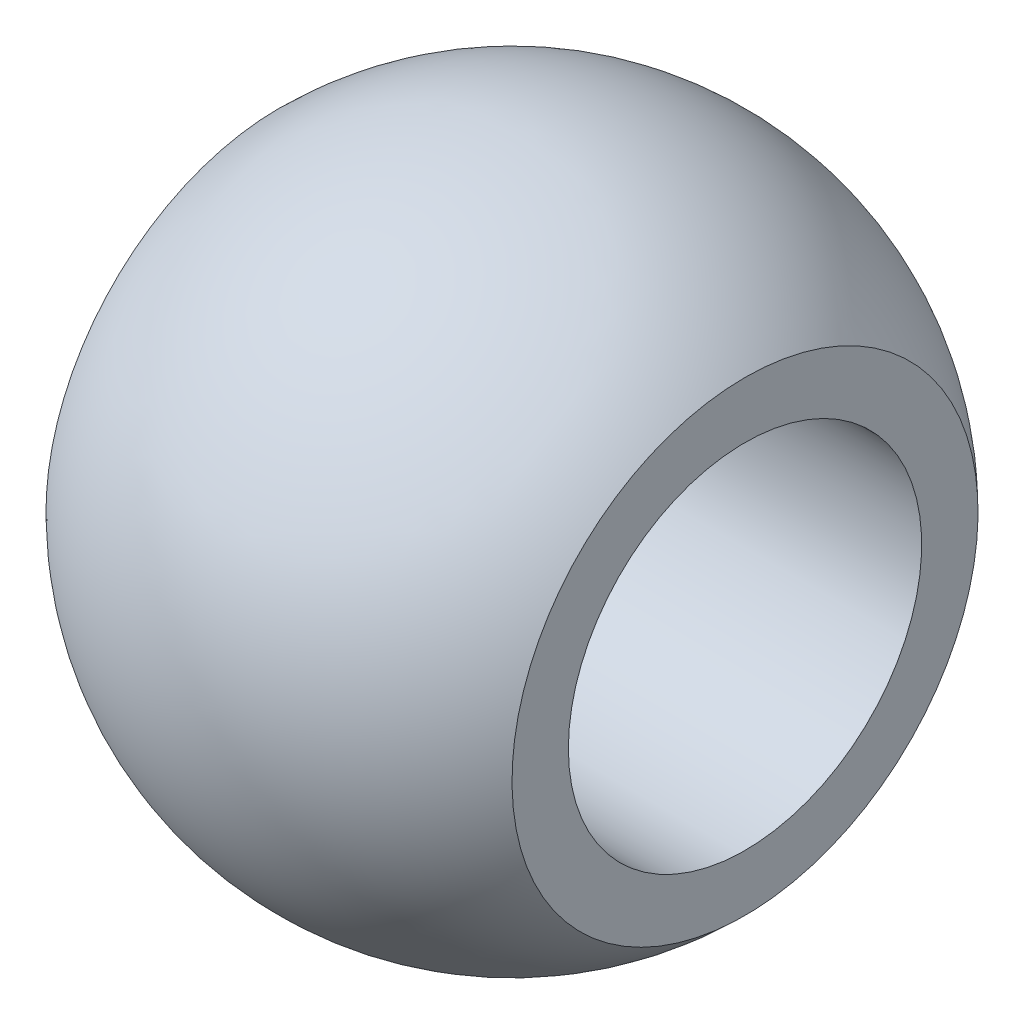
ISO-10303-21;
HEADER;
FILE_DESCRIPTION(('STEP AP214'),'2;1');
FILE_NAME('part.step','',(''),(''),'','','');
FILE_SCHEMA(('AUTOMOTIVE_DESIGN { 1 0 10303 214 1 1 1 1 }'));
ENDSEC;
DATA;
#1=APPLICATION_CONTEXT('core data for automotive mechanical design processes');
#2=APPLICATION_PROTOCOL_DEFINITION('international standard','automotive_design',2000,#1);
#3=PRODUCT_CONTEXT('',#1,'mechanical');
#4=PRODUCT('Part','Part','',(#3));
#5=PRODUCT_RELATED_PRODUCT_CATEGORY('part','',(#4));
#6=PRODUCT_DEFINITION_FORMATION('','',#4);
#7=PRODUCT_DEFINITION_CONTEXT('part definition',#1,'design');
#8=PRODUCT_DEFINITION('design','',#6,#7);
#9=PRODUCT_DEFINITION_SHAPE('','',#8);
#10=(LENGTH_UNIT() NAMED_UNIT(*) SI_UNIT(.MILLI.,.METRE.));
#11=(NAMED_UNIT(*) PLANE_ANGLE_UNIT() SI_UNIT($,.RADIAN.));
#12=(NAMED_UNIT(*) SI_UNIT($,.STERADIAN.) SOLID_ANGLE_UNIT());
#13=UNCERTAINTY_MEASURE_WITH_UNIT(LENGTH_MEASURE(1.E-05),#10,'distance_accuracy_value','');
#14=(GEOMETRIC_REPRESENTATION_CONTEXT(3) GLOBAL_UNCERTAINTY_ASSIGNED_CONTEXT((#13)) GLOBAL_UNIT_ASSIGNED_CONTEXT((#10,
#11,#12)) REPRESENTATION_CONTEXT('',''));
#15=CARTESIAN_POINT('',(0.,0.,0.));
#16=DIRECTION('',(0.,0.,1.));
#17=DIRECTION('',(1.,0.,0.));
#18=AXIS2_PLACEMENT_3D('',#15,#16,#17);
#19=CARTESIAN_POINT('',(-4.5,0.,0.));
#20=DIRECTION('',(-1.,0.,0.));
#21=DIRECTION('',(0.,0.,1.));
#22=AXIS2_PLACEMENT_3D('',#19,#20,#21);
#23=PLANE('',#22);
#24=CARTESIAN_POINT('',(-4.5,0.,0.));
#25=DIRECTION('',(-1.,0.,0.));
#26=DIRECTION('',(0.,0.,1.));
#27=AXIS2_PLACEMENT_3D('',#24,#25,#26);
#28=CIRCLE('',#27,4.5);
#29=CARTESIAN_POINT('',(-4.5,4.5,0.));
#30=VERTEX_POINT('',#29);
#31=EDGE_CURVE('E49',#30,#30,#28,.T.);
#32=ORIENTED_EDGE('',*,*,#31,.T.);
#33=EDGE_LOOP('',(#32));
#34=FACE_BOUND('',#33,.T.);
#35=CARTESIAN_POINT('',(-4.5,0.,0.));
#36=DIRECTION('',(-1.,0.,0.));
#37=DIRECTION('',(0.,0.,1.));
#38=AXIS2_PLACEMENT_3D('',#35,#36,#37);
#39=CIRCLE('',#38,3.41151905068336);
#40=CARTESIAN_POINT('',(-4.5,0.,3.41151905068336));
#41=VERTEX_POINT('',#40);
#42=EDGE_CURVE('E10',#41,#41,#39,.T.);
#43=ORIENTED_EDGE('',*,*,#42,.F.);
#44=EDGE_LOOP('',(#43));
#45=FACE_BOUND('',#44,.T.);
#46=ADVANCED_FACE('F35',(#34,#45),#23,.T.);
#47=CARTESIAN_POINT('',(-15.2152784756621,0.,0.));
#48=DIRECTION('',(-1.,0.,0.));
#49=DIRECTION('',(0.,0.,1.));
#50=AXIS2_PLACEMENT_3D('',#47,#48,#49);
#51=CYLINDRICAL_SURFACE('',#50,3.41151905068336);
#52=CARTESIAN_POINT('',(4.5,0.,0.));
#53=DIRECTION('',(-1.,0.,0.));
#54=DIRECTION('',(0.,0.,1.));
#55=AXIS2_PLACEMENT_3D('',#52,#53,#54);
#56=CIRCLE('',#55,3.41151905068336);
#57=CARTESIAN_POINT('',(4.5,0.,3.41151905068336));
#58=VERTEX_POINT('',#57);
#59=EDGE_CURVE('E41',#58,#58,#56,.T.);
#60=ORIENTED_EDGE('',*,*,#59,.F.);
#61=EDGE_LOOP('',(#60));
#62=FACE_BOUND('',#61,.T.);
#63=ORIENTED_EDGE('',*,*,#42,.T.);
#64=EDGE_LOOP('',(#63));
#65=FACE_BOUND('',#64,.T.);
#66=ADVANCED_FACE('F65',(#62,#65),#51,.F.);
#67=CARTESIAN_POINT('',(4.5,0.,0.));
#68=DIRECTION('',(-1.,0.,0.));
#69=DIRECTION('',(0.,0.,1.));
#70=AXIS2_PLACEMENT_3D('',#67,#68,#69);
#71=PLANE('',#70);
#72=CARTESIAN_POINT('',(4.5,0.,0.));
#73=DIRECTION('',(-1.,0.,0.));
#74=DIRECTION('',(0.,0.,1.));
#75=AXIS2_PLACEMENT_3D('',#72,#73,#74);
#76=CIRCLE('',#75,4.5);
#77=CARTESIAN_POINT('',(4.5,4.5,0.));
#78=VERTEX_POINT('',#77);
#79=EDGE_CURVE('E45',#78,#78,#76,.T.);
#80=ORIENTED_EDGE('',*,*,#79,.F.);
#81=EDGE_LOOP('',(#80));
#82=FACE_BOUND('',#81,.T.);
#83=ORIENTED_EDGE('',*,*,#59,.T.);
#84=EDGE_LOOP('',(#83));
#85=FACE_BOUND('',#84,.T.);
#86=ADVANCED_FACE('F60',(#82,#85),#71,.F.);
#87=CARTESIAN_POINT('',(0.,0.,0.));
#88=DIRECTION('',(-1.,0.,0.));
#89=DIRECTION('',(0.,1.,0.));
#90=AXIS2_PLACEMENT_3D('',#87,#88,#89);
#91=SPHERICAL_SURFACE('',#90,6.36396103067893);
#92=CARTESIAN_POINT('',(-4.5,4.5,0.));
#93=CARTESIAN_POINT('',(-4.42637040972548,4.57363271407349,0.));
#94=CARTESIAN_POINT('',(-4.35093070561752,4.64545504850886,0.));
#95=CARTESIAN_POINT('',(-4.19661933128227,4.78531312628446,0.));
#96=CARTESIAN_POINT('',(-4.117747661055,4.85334886962469,0.));
#97=CARTESIAN_POINT('',(-3.95676061602873,4.98546793339113,0.));
#98=CARTESIAN_POINT('',(-3.87464524122973,5.04955125381735,0.));
#99=CARTESIAN_POINT('',(-3.70736907835504,5.17361160596394,0.));
#100=CARTESIAN_POINT('',(-3.62220829027934,5.23358863768431,0.));
#101=CARTESIAN_POINT('',(-3.44904633520458,5.34929178408992,0.));
#102=CARTESIAN_POINT('',(-3.36104516820551,5.40501789877516,0.));
#103=CARTESIAN_POINT('',(-3.18241449141601,5.51208499910511,0.));
#104=CARTESIAN_POINT('',(-3.09178498162558,5.56342598474982,0.));
#105=CARTESIAN_POINT('',(-2.90811594467414,5.66159913213022,0.));
#106=CARTESIAN_POINT('',(-2.81507641751314,5.7084312938659,0.));
#107=CARTESIAN_POINT('',(-2.62681148860407,5.79747397331126,0.));
#108=CARTESIAN_POINT('',(-2.53158608685601,5.83968449102094,0.));
#109=CARTESIAN_POINT('',(-2.33917881445976,5.91938219286645,0.));
#110=CARTESIAN_POINT('',(-2.24199694381158,5.95686937700229,0.));
#111=CARTESIAN_POINT('',(-2.04591085342687,6.02703010198124,0.));
#112=CARTESIAN_POINT('',(-1.94700663369035,6.05970364282434,0.));
#113=CARTESIAN_POINT('',(-1.74771411401087,6.12015836774483,0.));
#114=CARTESIAN_POINT('',(-1.64732581406791,6.14793955182222,0.));
#115=CARTESIAN_POINT('',(-1.44530697819554,6.19854263591922,0.));
#116=CARTESIAN_POINT('',(-1.34367644226613,6.22136453593883,0.));
#117=CARTESIAN_POINT('',(-1.13941797128036,6.26199407196049,0.));
#118=CARTESIAN_POINT('',(-1.03679003622399,6.27980170796254,0.));
#119=CARTESIAN_POINT('',(-0.830784006669909,6.31035981579516,0.));
#120=CARTESIAN_POINT('',(-0.727405912172186,6.32311028762574,0.));
#121=CARTESIAN_POINT('',(-0.520148610619636,6.3435233501117,0.));
#122=CARTESIAN_POINT('',(-0.41626940356481,6.35118594076709,0.));
#123=CARTESIAN_POINT('',(-0.208260131006655,6.36140478105071,0.));
#124=CARTESIAN_POINT('',(-0.104130065503327,6.36396103067893,0.));
#125=CARTESIAN_POINT('',(0.104130065503329,6.36396103067893,0.));
#126=CARTESIAN_POINT('',(0.208260131006657,6.3614047810507,0.));
#127=CARTESIAN_POINT('',(0.416269403564811,6.35118594076709,0.));
#128=CARTESIAN_POINT('',(0.520148610619638,6.3435233501117,0.));
#129=CARTESIAN_POINT('',(0.727405912172187,6.32311028762574,0.));
#130=CARTESIAN_POINT('',(0.83078400666991,6.31035981579516,0.));
#131=CARTESIAN_POINT('',(1.036790036224,6.27980170796254,0.));
#132=CARTESIAN_POINT('',(1.13941797128036,6.26199407196049,0.));
#133=CARTESIAN_POINT('',(1.34367644226613,6.22136453593883,0.));
#134=CARTESIAN_POINT('',(1.44530697819554,6.19854263591922,0.));
#135=CARTESIAN_POINT('',(1.64732581406791,6.14793955182222,0.));
#136=CARTESIAN_POINT('',(1.74771411401087,6.12015836774483,0.));
#137=CARTESIAN_POINT('',(1.94700663369035,6.05970364282434,0.));
#138=CARTESIAN_POINT('',(2.04591085342687,6.02703010198124,0.));
#139=CARTESIAN_POINT('',(2.24199694381158,5.95686937700229,0.));
#140=CARTESIAN_POINT('',(2.33917881445976,5.91938219286645,0.));
#141=CARTESIAN_POINT('',(2.53158608685601,5.83968449102094,0.));
#142=CARTESIAN_POINT('',(2.62681148860407,5.79747397331126,0.));
#143=CARTESIAN_POINT('',(2.81507641751314,5.7084312938659,0.));
#144=CARTESIAN_POINT('',(2.90811594467414,5.66159913213022,0.));
#145=CARTESIAN_POINT('',(3.09178498162558,5.56342598474982,0.));
#146=CARTESIAN_POINT('',(3.18241449141601,5.51208499910511,0.));
#147=CARTESIAN_POINT('',(3.36104516820551,5.40501789877516,0.));
#148=CARTESIAN_POINT('',(3.44904633520458,5.34929178408992,0.));
#149=CARTESIAN_POINT('',(3.62220829027934,5.23358863768431,0.));
#150=CARTESIAN_POINT('',(3.70736907835504,5.17361160596394,0.));
#151=CARTESIAN_POINT('',(3.87464524122973,5.04955125381735,0.));
#152=CARTESIAN_POINT('',(3.95676061602873,4.98546793339113,0.));
#153=CARTESIAN_POINT('',(4.117747661055,4.85334886962469,0.));
#154=CARTESIAN_POINT('',(4.19661933128227,4.78531312628445,0.));
#155=CARTESIAN_POINT('',(4.35093070561752,4.64545504850886,0.));
#156=CARTESIAN_POINT('',(4.42637040972548,4.57363271407349,0.));
#157=CARTESIAN_POINT('',(4.5,4.5,0.));
#158=B_SPLINE_CURVE_WITH_KNOTS('',3,(#92,#93,#94,#95,#96,#97,#98,#99,#100,#101,#102,#103,#104,
#105,#106,#107,#108,#109,#110,#111,#112,#113,#114,#115,#116,#117,#118,#119,#120,#121,#122,#123,
#124,#125,#126,#127,#128,#129,#130,#131,#132,#133,#134,#135,#136,#137,#138,#139,#140,#141,#142,
#143,#144,#145,#146,#147,#148,#149,#150,#151,#152,#153,#154,#155,#156,#157),.UNSPECIFIED.,.F.,
.F.,(4,2,2,2,2,2,2,2,2,2,2,2,2,2,2,2,2,2,2,2,2,2,2,2,2,2,2,2,2,2,2,2,4),(0.,0.3123588439296,
0.624717687859199,0.9370765317888,1.2494353757184,1.561794219648,1.8741530635776,
2.1865119075072,2.4988707514368,2.8112295953664,3.123588439296,3.4359472832256,3.7483061271552,
4.0606649710848,4.3730238150144,4.685382658944,4.9977415028736,5.3101003468032,5.6224591907328,
5.9348180346624,6.247176878592,6.5595357225216,6.8718945664512,7.1842534103808,7.4966122543104,
7.80897109824,8.1213299421696,8.4336887860992,8.7460476300288,9.0584064739584,9.370765317888,
9.6831241618176,9.9954830057472),.UNSPECIFIED.);
#159=EDGE_CURVE('BSEAM57',#30,#78,#158,.T.);
#160=ORIENTED_EDGE('',*,*,#31,.F.);
#161=ORIENTED_EDGE('',*,*,#79,.T.);
#162=ORIENTED_EDGE('',*,*,#159,.T.);
#163=ORIENTED_EDGE('',*,*,#159,.F.);
#164=EDGE_LOOP('',(#160,#162,#161,#163));
#165=FACE_BOUND('',#164,.T.);
#166=ADVANCED_FACE('F57',(#165),#91,.T.);
#167=CLOSED_SHELL('',(#46,#66,#86,#166));
#168=MANIFOLD_SOLID_BREP('B2',#167);
#169=ADVANCED_BREP_SHAPE_REPRESENTATION('',(#18,#168),#14);
#170=SHAPE_DEFINITION_REPRESENTATION(#9,#169);
ENDSEC;
END-ISO-10303-21;
